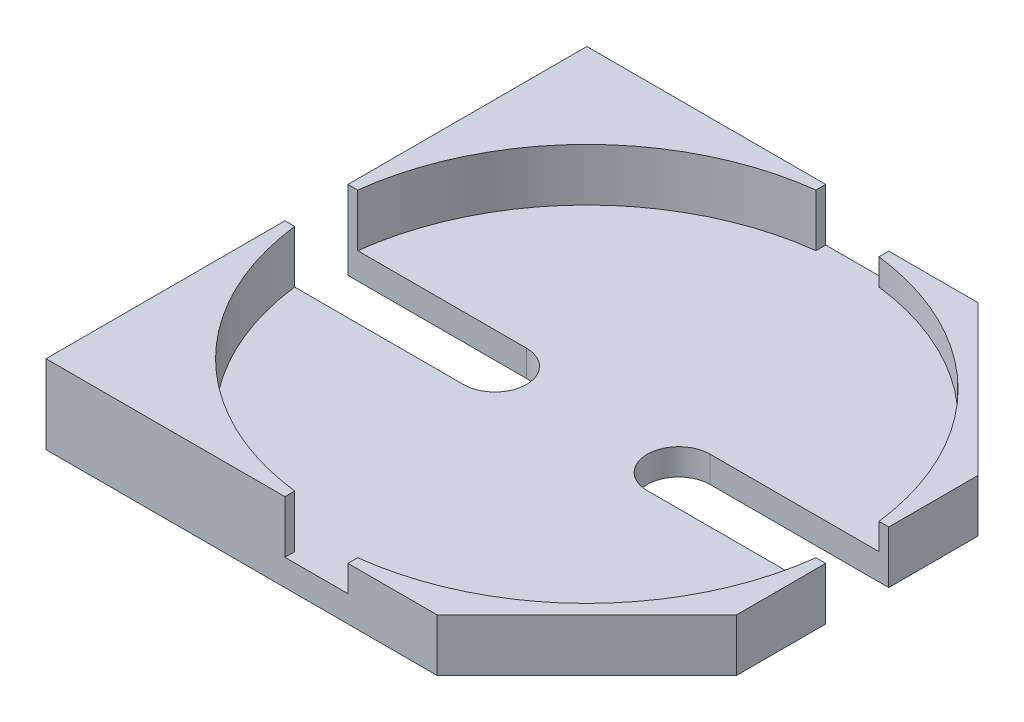
ISO-10303-21;
HEADER;
FILE_DESCRIPTION(('STEP AP214'),'2;1');
FILE_NAME('part.step','',(''),(''),'','','');
FILE_SCHEMA(('AUTOMOTIVE_DESIGN { 1 0 10303 214 1 1 1 1 }'));
ENDSEC;
DATA;
#1=APPLICATION_CONTEXT('core data for automotive mechanical design processes');
#2=APPLICATION_PROTOCOL_DEFINITION('international standard','automotive_design',2000,#1);
#3=PRODUCT_CONTEXT('',#1,'mechanical');
#4=PRODUCT('Part','Part','',(#3));
#5=PRODUCT_RELATED_PRODUCT_CATEGORY('part','',(#4));
#6=PRODUCT_DEFINITION_FORMATION('','',#4);
#7=PRODUCT_DEFINITION_CONTEXT('part definition',#1,'design');
#8=PRODUCT_DEFINITION('design','',#6,#7);
#9=PRODUCT_DEFINITION_SHAPE('','',#8);
#10=(LENGTH_UNIT() NAMED_UNIT(*) SI_UNIT(.MILLI.,.METRE.));
#11=(NAMED_UNIT(*) PLANE_ANGLE_UNIT() SI_UNIT($,.RADIAN.));
#12=(NAMED_UNIT(*) SI_UNIT($,.STERADIAN.) SOLID_ANGLE_UNIT());
#13=UNCERTAINTY_MEASURE_WITH_UNIT(LENGTH_MEASURE(1.E-05),#10,'distance_accuracy_value','');
#14=(GEOMETRIC_REPRESENTATION_CONTEXT(3) GLOBAL_UNCERTAINTY_ASSIGNED_CONTEXT((#13)) GLOBAL_UNIT_ASSIGNED_CONTEXT((#10,
#11,#12)) REPRESENTATION_CONTEXT('',''));
#15=CARTESIAN_POINT('',(0.,0.,0.));
#16=DIRECTION('',(0.,0.,1.));
#17=DIRECTION('',(1.,0.,0.));
#18=AXIS2_PLACEMENT_3D('',#15,#16,#17);
#19=CARTESIAN_POINT('',(1.75,0.5,0.));
#20=DIRECTION('',(0.,1.,0.));
#21=DIRECTION('',(0.,0.,1.));
#22=AXIS2_PLACEMENT_3D('',#19,#20,#21);
#23=PLANE('',#22);
#24=CARTESIAN_POINT('',(0.,0.5,0.));
#25=DIRECTION('',(0.,1.,0.));
#26=DIRECTION('',(0.,0.,1.));
#27=AXIS2_PLACEMENT_3D('',#24,#25,#26);
#28=CIRCLE('',#27,5.);
#29=CARTESIAN_POINT('',(0.600000000000001,0.5,4.96386945839634));
#30=VERTEX_POINT('',#29);
#31=CARTESIAN_POINT('',(4.96386945839634,0.5,0.6));
#32=VERTEX_POINT('',#31);
#33=EDGE_CURVE('E221',#30,#32,#28,.T.);
#34=ORIENTED_EDGE('',*,*,#33,.T.);
#35=DIRECTION('',(-1.,0.,0.));
#36=VECTOR('',#35,1.);
#37=CARTESIAN_POINT('',(1.75,0.5,0.6));
#38=LINE('',#37,#36);
#39=CARTESIAN_POINT('',(1.75,0.5,0.6));
#40=VERTEX_POINT('',#39);
#41=EDGE_CURVE('E340',#32,#40,#38,.T.);
#42=ORIENTED_EDGE('',*,*,#41,.T.);
#43=CARTESIAN_POINT('',(1.75,0.5,0.));
#44=DIRECTION('',(0.,-1.,0.));
#45=DIRECTION('',(0.,0.,1.));
#46=AXIS2_PLACEMENT_3D('',#43,#44,#45);
#47=CIRCLE('',#46,0.6);
#48=CARTESIAN_POINT('',(1.75,0.5,-0.6));
#49=VERTEX_POINT('',#48);
#50=EDGE_CURVE('E343',#40,#49,#47,.T.);
#51=ORIENTED_EDGE('',*,*,#50,.T.);
#52=DIRECTION('',(1.,0.,0.));
#53=VECTOR('',#52,1.);
#54=CARTESIAN_POINT('',(1.75,0.5,-0.6));
#55=LINE('',#54,#53);
#56=CARTESIAN_POINT('',(4.96386945839634,0.5,-0.599999999999999));
#57=VERTEX_POINT('',#56);
#58=EDGE_CURVE('E345',#49,#57,#55,.T.);
#59=ORIENTED_EDGE('',*,*,#58,.T.);
#60=CARTESIAN_POINT('',(0.,0.5,0.));
#61=DIRECTION('',(0.,1.,0.));
#62=DIRECTION('',(0.,0.,1.));
#63=AXIS2_PLACEMENT_3D('',#60,#61,#62);
#64=CIRCLE('',#63,5.);
#65=CARTESIAN_POINT('',(0.6,0.5,-4.96386945839634));
#66=VERTEX_POINT('',#65);
#67=EDGE_CURVE('E224',#57,#66,#64,.T.);
#68=ORIENTED_EDGE('',*,*,#67,.T.);
#69=DIRECTION('',(0.,0.,1.));
#70=VECTOR('',#69,1.);
#71=CARTESIAN_POINT('',(0.6,0.5,0.));
#72=LINE('',#71,#70);
#73=CARTESIAN_POINT('',(0.6,0.5,-5.15));
#74=VERTEX_POINT('',#73);
#75=EDGE_CURVE('E258',#74,#66,#72,.T.);
#76=ORIENTED_EDGE('',*,*,#75,.F.);
#77=DIRECTION('',(-1.,0.,0.));
#78=VECTOR('',#77,1.);
#79=CARTESIAN_POINT('',(2.29999999999999,0.5,-5.15));
#80=LINE('',#79,#78);
#81=CARTESIAN_POINT('',(-0.600000000000016,0.5,-5.15));
#82=VERTEX_POINT('',#81);
#83=EDGE_CURVE('E347',#74,#82,#80,.T.);
#84=ORIENTED_EDGE('',*,*,#83,.T.);
#85=DIRECTION('',(0.,0.,1.));
#86=VECTOR('',#85,1.);
#87=CARTESIAN_POINT('',(-0.600000000000016,0.5,0.));
#88=LINE('',#87,#86);
#89=CARTESIAN_POINT('',(-0.600000000000016,0.5,-4.96386945839634));
#90=VERTEX_POINT('',#89);
#91=EDGE_CURVE('E315',#82,#90,#88,.T.);
#92=ORIENTED_EDGE('',*,*,#91,.T.);
#93=CARTESIAN_POINT('',(0.,0.5,0.));
#94=DIRECTION('',(0.,1.,0.));
#95=DIRECTION('',(0.,0.,1.));
#96=AXIS2_PLACEMENT_3D('',#93,#94,#95);
#97=CIRCLE('',#96,5.);
#98=CARTESIAN_POINT('',(-4.96386945839634,0.5,-0.6));
#99=VERTEX_POINT('',#98);
#100=EDGE_CURVE('E310',#90,#99,#97,.T.);
#101=ORIENTED_EDGE('',*,*,#100,.T.);
#102=DIRECTION('',(1.,0.,0.));
#103=VECTOR('',#102,1.);
#104=CARTESIAN_POINT('',(-1.75,0.5,-0.6));
#105=LINE('',#104,#103);
#106=CARTESIAN_POINT('',(-1.75,0.5,-0.6));
#107=VERTEX_POINT('',#106);
#108=EDGE_CURVE('E349',#99,#107,#105,.T.);
#109=ORIENTED_EDGE('',*,*,#108,.T.);
#110=CARTESIAN_POINT('',(-1.75,0.5,0.));
#111=DIRECTION('',(0.,-1.,0.));
#112=DIRECTION('',(0.,0.,1.));
#113=AXIS2_PLACEMENT_3D('',#110,#111,#112);
#114=CIRCLE('',#113,0.6);
#115=CARTESIAN_POINT('',(-1.75,0.5,0.6));
#116=VERTEX_POINT('',#115);
#117=EDGE_CURVE('E351',#107,#116,#114,.T.);
#118=ORIENTED_EDGE('',*,*,#117,.T.);
#119=DIRECTION('',(-1.,0.,0.));
#120=VECTOR('',#119,1.);
#121=CARTESIAN_POINT('',(-1.75,0.5,0.6));
#122=LINE('',#121,#120);
#123=CARTESIAN_POINT('',(-4.96386945839634,0.5,0.599999999999999));
#124=VERTEX_POINT('',#123);
#125=EDGE_CURVE('E353',#116,#124,#122,.T.);
#126=ORIENTED_EDGE('',*,*,#125,.T.);
#127=CARTESIAN_POINT('',(0.,0.5,0.));
#128=DIRECTION('',(0.,1.,0.));
#129=DIRECTION('',(0.,0.,1.));
#130=AXIS2_PLACEMENT_3D('',#127,#128,#129);
#131=CIRCLE('',#130,5.);
#132=CARTESIAN_POINT('',(-0.600000000000008,0.5,4.96386945839634));
#133=VERTEX_POINT('',#132);
#134=EDGE_CURVE('E283',#124,#133,#131,.T.);
#135=ORIENTED_EDGE('',*,*,#134,.T.);
#136=DIRECTION('',(0.,0.,-1.));
#137=VECTOR('',#136,1.);
#138=CARTESIAN_POINT('',(-0.600000000000008,0.5,0.));
#139=LINE('',#138,#137);
#140=CARTESIAN_POINT('',(-0.600000000000008,0.5,5.15));
#141=VERTEX_POINT('',#140);
#142=EDGE_CURVE('E288',#141,#133,#139,.T.);
#143=ORIENTED_EDGE('',*,*,#142,.F.);
#144=DIRECTION('',(1.,0.,0.));
#145=VECTOR('',#144,1.);
#146=CARTESIAN_POINT('',(2.30000000000003,0.5,5.15));
#147=LINE('',#146,#145);
#148=CARTESIAN_POINT('',(0.600000000000001,0.5,5.15));
#149=VERTEX_POINT('',#148);
#150=EDGE_CURVE('E63',#141,#149,#147,.T.);
#151=ORIENTED_EDGE('',*,*,#150,.T.);
#152=DIRECTION('',(0.,0.,-1.));
#153=VECTOR('',#152,1.);
#154=CARTESIAN_POINT('',(0.600000000000001,0.5,0.));
#155=LINE('',#154,#153);
#156=EDGE_CURVE('E58',#149,#30,#155,.T.);
#157=ORIENTED_EDGE('',*,*,#156,.T.);
#158=EDGE_LOOP('',(#34,#42,#51,#59,#68,#76,#84,#92,#101,#109,#118,#126,#135,#143,#151,#157));
#159=FACE_BOUND('',#158,.T.);
#160=ADVANCED_FACE('F43',(#159),#23,.T.);
#161=CARTESIAN_POINT('',(-5.15,0.5,0.599999999999999));
#162=DIRECTION('',(1.,0.,0.));
#163=DIRECTION('',(0.,0.,-1.));
#164=AXIS2_PLACEMENT_3D('',#161,#162,#163);
#165=PLANE('',#164);
#166=DIRECTION('',(0.,0.,1.));
#167=VECTOR('',#166,1.);
#168=CARTESIAN_POINT('',(-5.15,0.,0.599999999999999));
#169=LINE('',#168,#167);
#170=CARTESIAN_POINT('',(-5.15,0.,0.599999999999999));
#171=VERTEX_POINT('',#170);
#172=CARTESIAN_POINT('',(-5.15,0.,5.15));
#173=VERTEX_POINT('',#172);
#174=EDGE_CURVE('E338',#171,#173,#169,.T.);
#175=ORIENTED_EDGE('',*,*,#174,.T.);
#176=DIRECTION('',(0.,-1.,0.));
#177=VECTOR('',#176,1.);
#178=CARTESIAN_POINT('',(-5.15,0.5,5.15));
#179=LINE('',#178,#177);
#180=CARTESIAN_POINT('',(-5.15,1.5,5.15));
#181=VERTEX_POINT('',#180);
#182=EDGE_CURVE('E11',#181,#173,#179,.T.);
#183=ORIENTED_EDGE('',*,*,#182,.F.);
#184=DIRECTION('',(0.,0.,1.));
#185=VECTOR('',#184,1.);
#186=CARTESIAN_POINT('',(-5.15,1.5,0.));
#187=LINE('',#186,#185);
#188=CARTESIAN_POINT('',(-5.15,1.5,0.599999999999999));
#189=VERTEX_POINT('',#188);
#190=EDGE_CURVE('E291',#189,#181,#187,.T.);
#191=ORIENTED_EDGE('',*,*,#190,.F.);
#192=DIRECTION('',(0.,-1.,0.));
#193=VECTOR('',#192,1.);
#194=CARTESIAN_POINT('',(-5.15,0.5,0.599999999999999));
#195=LINE('',#194,#193);
#196=EDGE_CURVE('E355',#189,#171,#195,.T.);
#197=ORIENTED_EDGE('',*,*,#196,.T.);
#198=EDGE_LOOP('',(#175,#183,#191,#197));
#199=FACE_BOUND('',#198,.T.);
#200=ADVANCED_FACE('F45',(#199),#165,.F.);
#201=CARTESIAN_POINT('',(2.30000000000003,0.5,5.15));
#202=DIRECTION('',(0.,0.,-1.));
#203=DIRECTION('',(-1.,0.,0.));
#204=AXIS2_PLACEMENT_3D('',#201,#202,#203);
#205=PLANE('',#204);
#206=DIRECTION('',(1.,0.,0.));
#207=VECTOR('',#206,1.);
#208=CARTESIAN_POINT('',(2.30000000000003,0.,5.15));
#209=LINE('',#208,#207);
#210=CARTESIAN_POINT('',(2.30000000000003,0.,5.15));
#211=VERTEX_POINT('',#210);
#212=EDGE_CURVE('E358',#173,#211,#209,.T.);
#213=ORIENTED_EDGE('',*,*,#212,.T.);
#214=DIRECTION('',(0.,-1.,0.));
#215=VECTOR('',#214,1.);
#216=CARTESIAN_POINT('',(2.30000000000003,0.5,5.15));
#217=LINE('',#216,#215);
#218=CARTESIAN_POINT('',(2.30000000000003,1.,5.15));
#219=VERTEX_POINT('',#218);
#220=EDGE_CURVE('E51',#219,#211,#217,.T.);
#221=ORIENTED_EDGE('',*,*,#220,.F.);
#222=DIRECTION('',(1.,0.,0.));
#223=VECTOR('',#222,1.);
#224=CARTESIAN_POINT('',(0.,1.,5.15));
#225=LINE('',#224,#223);
#226=CARTESIAN_POINT('',(0.600000000000001,1.,5.15));
#227=VERTEX_POINT('',#226);
#228=EDGE_CURVE('E239',#227,#219,#225,.T.);
#229=ORIENTED_EDGE('',*,*,#228,.F.);
#230=DIRECTION('',(0.,-1.,0.));
#231=VECTOR('',#230,1.);
#232=CARTESIAN_POINT('',(0.600000000000001,1.,5.15));
#233=LINE('',#232,#231);
#234=EDGE_CURVE('E225',#227,#149,#233,.T.);
#235=ORIENTED_EDGE('',*,*,#234,.T.);
#236=ORIENTED_EDGE('',*,*,#150,.F.);
#237=DIRECTION('',(0.,-1.,0.));
#238=VECTOR('',#237,1.);
#239=CARTESIAN_POINT('',(-0.600000000000008,1.5,5.15));
#240=LINE('',#239,#238);
#241=CARTESIAN_POINT('',(-0.600000000000008,1.5,5.15));
#242=VERTEX_POINT('',#241);
#243=EDGE_CURVE('E304',#242,#141,#240,.T.);
#244=ORIENTED_EDGE('',*,*,#243,.F.);
#245=DIRECTION('',(1.,0.,0.));
#246=VECTOR('',#245,1.);
#247=CARTESIAN_POINT('',(0.,1.5,5.15));
#248=LINE('',#247,#246);
#249=EDGE_CURVE('E294',#181,#242,#248,.T.);
#250=ORIENTED_EDGE('',*,*,#249,.F.);
#251=ORIENTED_EDGE('',*,*,#182,.T.);
#252=EDGE_LOOP('',(#213,#221,#229,#235,#236,#244,#250,#251));
#253=FACE_BOUND('',#252,.T.);
#254=ADVANCED_FACE('F441',(#253),#205,.F.);
#255=CARTESIAN_POINT('',(2.30000000000003,0.5,5.15));
#256=DIRECTION('',(-0.707106781186552,0.,-0.707106781186544));
#257=DIRECTION('',(-0.707106781186544,0.,0.707106781186552));
#258=AXIS2_PLACEMENT_3D('',#255,#256,#257);
#259=PLANE('',#258);
#260=DIRECTION('',(0.707106781186544,0.,-0.707106781186552));
#261=VECTOR('',#260,1.);
#262=CARTESIAN_POINT('',(2.30000000000003,0.,5.15));
#263=LINE('',#262,#261);
#264=CARTESIAN_POINT('',(5.15,0.,2.3));
#265=VERTEX_POINT('',#264);
#266=EDGE_CURVE('E360',#211,#265,#263,.T.);
#267=ORIENTED_EDGE('',*,*,#266,.T.);
#268=DIRECTION('',(0.,-1.,0.));
#269=VECTOR('',#268,1.);
#270=CARTESIAN_POINT('',(5.15,0.5,2.3));
#271=LINE('',#270,#269);
#272=CARTESIAN_POINT('',(5.15,1.,2.3));
#273=VERTEX_POINT('',#272);
#274=EDGE_CURVE('E415',#273,#265,#271,.T.);
#275=ORIENTED_EDGE('',*,*,#274,.F.);
#276=DIRECTION('',(0.707106781186544,0.,-0.707106781186552));
#277=VECTOR('',#276,1.);
#278=CARTESIAN_POINT('',(3.72500000000003,1.,3.72499999999999));
#279=LINE('',#278,#277);
#280=EDGE_CURVE('E241',#219,#273,#279,.T.);
#281=ORIENTED_EDGE('',*,*,#280,.F.);
#282=ORIENTED_EDGE('',*,*,#220,.T.);
#283=EDGE_LOOP('',(#267,#275,#281,#282));
#284=FACE_BOUND('',#283,.T.);
#285=ADVANCED_FACE('F421',(#284),#259,.F.);
#286=CARTESIAN_POINT('',(5.15,0.5,0.599999999999999));
#287=DIRECTION('',(-1.,0.,0.));
#288=DIRECTION('',(0.,0.,1.));
#289=AXIS2_PLACEMENT_3D('',#286,#287,#288);
#290=PLANE('',#289);
#291=DIRECTION('',(0.,0.,-1.));
#292=VECTOR('',#291,1.);
#293=CARTESIAN_POINT('',(5.15,0.,0.599999999999999));
#294=LINE('',#293,#292);
#295=CARTESIAN_POINT('',(5.15,0.,0.599999999999999));
#296=VERTEX_POINT('',#295);
#297=EDGE_CURVE('E362',#265,#296,#294,.T.);
#298=ORIENTED_EDGE('',*,*,#297,.T.);
#299=DIRECTION('',(0.,-1.,0.));
#300=VECTOR('',#299,1.);
#301=CARTESIAN_POINT('',(5.15,0.5,0.599999999999999));
#302=LINE('',#301,#300);
#303=CARTESIAN_POINT('',(5.15,1.,0.599999999999999));
#304=VERTEX_POINT('',#303);
#305=EDGE_CURVE('E412',#304,#296,#302,.T.);
#306=ORIENTED_EDGE('',*,*,#305,.F.);
#307=DIRECTION('',(0.,0.,-1.));
#308=VECTOR('',#307,1.);
#309=CARTESIAN_POINT('',(5.15,1.,0.));
#310=LINE('',#309,#308);
#311=EDGE_CURVE('E246',#273,#304,#310,.T.);
#312=ORIENTED_EDGE('',*,*,#311,.F.);
#313=ORIENTED_EDGE('',*,*,#274,.T.);
#314=EDGE_LOOP('',(#298,#306,#312,#313));
#315=FACE_BOUND('',#314,.T.);
#316=ADVANCED_FACE('F430',(#315),#290,.F.);
#317=CARTESIAN_POINT('',(1.75,0.5,0.6));
#318=DIRECTION('',(0.,0.,1.));
#319=DIRECTION('',(1.,0.,0.));
#320=AXIS2_PLACEMENT_3D('',#317,#318,#319);
#321=PLANE('',#320);
#322=DIRECTION('',(-1.,0.,0.));
#323=VECTOR('',#322,1.);
#324=CARTESIAN_POINT('',(1.75,0.,0.6));
#325=LINE('',#324,#323);
#326=CARTESIAN_POINT('',(1.75,0.,0.6));
#327=VERTEX_POINT('',#326);
#328=EDGE_CURVE('E364',#296,#327,#325,.T.);
#329=ORIENTED_EDGE('',*,*,#328,.T.);
#330=DIRECTION('',(0.,-1.,0.));
#331=VECTOR('',#330,1.);
#332=CARTESIAN_POINT('',(1.75,0.5,0.6));
#333=LINE('',#332,#331);
#334=EDGE_CURVE('E409',#40,#327,#333,.T.);
#335=ORIENTED_EDGE('',*,*,#334,.F.);
#336=ORIENTED_EDGE('',*,*,#41,.F.);
#337=DIRECTION('',(0.,-1.,0.));
#338=VECTOR('',#337,1.);
#339=CARTESIAN_POINT('',(4.96386945839634,1.,0.6));
#340=LINE('',#339,#338);
#341=CARTESIAN_POINT('',(4.96386945839634,1.,0.6));
#342=VERTEX_POINT('',#341);
#343=EDGE_CURVE('E249',#342,#32,#340,.T.);
#344=ORIENTED_EDGE('',*,*,#343,.F.);
#345=DIRECTION('',(-1.,0.,0.));
#346=VECTOR('',#345,1.);
#347=CARTESIAN_POINT('',(0.,1.,0.6));
#348=LINE('',#347,#346);
#349=EDGE_CURVE('E234',#304,#342,#348,.T.);
#350=ORIENTED_EDGE('',*,*,#349,.F.);
#351=ORIENTED_EDGE('',*,*,#305,.T.);
#352=EDGE_LOOP('',(#329,#335,#336,#344,#350,#351));
#353=FACE_BOUND('',#352,.T.);
#354=ADVANCED_FACE('F433',(#353),#321,.F.);
#355=CARTESIAN_POINT('',(1.75,0.5,0.));
#356=DIRECTION('',(0.,-1.,0.));
#357=DIRECTION('',(0.,0.,-1.));
#358=AXIS2_PLACEMENT_3D('',#355,#356,#357);
#359=CYLINDRICAL_SURFACE('',#358,0.6);
#360=CARTESIAN_POINT('',(1.75,0.,0.));
#361=DIRECTION('',(0.,-1.,0.));
#362=DIRECTION('',(0.,0.,1.));
#363=AXIS2_PLACEMENT_3D('',#360,#361,#362);
#364=CIRCLE('',#363,0.6);
#365=CARTESIAN_POINT('',(1.75,0.,-0.6));
#366=VERTEX_POINT('',#365);
#367=EDGE_CURVE('E366',#327,#366,#364,.T.);
#368=ORIENTED_EDGE('',*,*,#367,.T.);
#369=DIRECTION('',(0.,-1.,0.));
#370=VECTOR('',#369,1.);
#371=CARTESIAN_POINT('',(1.75,0.5,-0.6));
#372=LINE('',#371,#370);
#373=EDGE_CURVE('E406',#49,#366,#372,.T.);
#374=ORIENTED_EDGE('',*,*,#373,.F.);
#375=ORIENTED_EDGE('',*,*,#50,.F.);
#376=ORIENTED_EDGE('',*,*,#334,.T.);
#377=EDGE_LOOP('',(#368,#374,#375,#376));
#378=FACE_BOUND('',#377,.T.);
#379=ADVANCED_FACE('F480',(#378),#359,.F.);
#380=CARTESIAN_POINT('',(1.75,0.5,-0.6));
#381=DIRECTION('',(0.,0.,-1.));
#382=DIRECTION('',(-1.,0.,0.));
#383=AXIS2_PLACEMENT_3D('',#380,#381,#382);
#384=PLANE('',#383);
#385=DIRECTION('',(1.,0.,0.));
#386=VECTOR('',#385,1.);
#387=CARTESIAN_POINT('',(1.75,0.,-0.6));
#388=LINE('',#387,#386);
#389=CARTESIAN_POINT('',(5.15,0.,-0.599999999999999));
#390=VERTEX_POINT('',#389);
#391=EDGE_CURVE('E368',#366,#390,#388,.T.);
#392=ORIENTED_EDGE('',*,*,#391,.T.);
#393=DIRECTION('',(0.,-1.,0.));
#394=VECTOR('',#393,1.);
#395=CARTESIAN_POINT('',(5.15,0.5,-0.599999999999999));
#396=LINE('',#395,#394);
#397=CARTESIAN_POINT('',(5.15,1.,-0.599999999999999));
#398=VERTEX_POINT('',#397);
#399=EDGE_CURVE('E403',#398,#390,#396,.T.);
#400=ORIENTED_EDGE('',*,*,#399,.F.);
#401=DIRECTION('',(1.,0.,0.));
#402=VECTOR('',#401,1.);
#403=CARTESIAN_POINT('',(0.,1.,-0.6));
#404=LINE('',#403,#402);
#405=CARTESIAN_POINT('',(4.96386945839634,1.,-0.6));
#406=VERTEX_POINT('',#405);
#407=EDGE_CURVE('E257',#406,#398,#404,.T.);
#408=ORIENTED_EDGE('',*,*,#407,.F.);
#409=DIRECTION('',(0.,-1.,0.));
#410=VECTOR('',#409,1.);
#411=CARTESIAN_POINT('',(4.96386945839634,1.,-0.6));
#412=LINE('',#411,#410);
#413=EDGE_CURVE('E280',#406,#57,#412,.T.);
#414=ORIENTED_EDGE('',*,*,#413,.T.);
#415=ORIENTED_EDGE('',*,*,#58,.F.);
#416=ORIENTED_EDGE('',*,*,#373,.T.);
#417=EDGE_LOOP('',(#392,#400,#408,#414,#415,#416));
#418=FACE_BOUND('',#417,.T.);
#419=ADVANCED_FACE('F476',(#418),#384,.F.);
#420=CARTESIAN_POINT('',(5.15,0.5,-2.3));
#421=DIRECTION('',(-1.,0.,0.));
#422=DIRECTION('',(0.,0.,1.));
#423=AXIS2_PLACEMENT_3D('',#420,#421,#422);
#424=PLANE('',#423);
#425=DIRECTION('',(0.,0.,-1.));
#426=VECTOR('',#425,1.);
#427=CARTESIAN_POINT('',(5.15,0.,-2.3));
#428=LINE('',#427,#426);
#429=CARTESIAN_POINT('',(5.15,0.,-2.3));
#430=VERTEX_POINT('',#429);
#431=EDGE_CURVE('E370',#390,#430,#428,.T.);
#432=ORIENTED_EDGE('',*,*,#431,.T.);
#433=DIRECTION('',(0.,-1.,0.));
#434=VECTOR('',#433,1.);
#435=CARTESIAN_POINT('',(5.15,0.5,-2.3));
#436=LINE('',#435,#434);
#437=CARTESIAN_POINT('',(5.15,1.,-2.3));
#438=VERTEX_POINT('',#437);
#439=EDGE_CURVE('E400',#438,#430,#436,.T.);
#440=ORIENTED_EDGE('',*,*,#439,.F.);
#441=DIRECTION('',(0.,0.,-1.));
#442=VECTOR('',#441,1.);
#443=CARTESIAN_POINT('',(5.15,1.,0.));
#444=LINE('',#443,#442);
#445=EDGE_CURVE('E261',#398,#438,#444,.T.);
#446=ORIENTED_EDGE('',*,*,#445,.F.);
#447=ORIENTED_EDGE('',*,*,#399,.T.);
#448=EDGE_LOOP('',(#432,#440,#446,#447));
#449=FACE_BOUND('',#448,.T.);
#450=ADVANCED_FACE('F472',(#449),#424,.F.);
#451=CARTESIAN_POINT('',(2.29999999999999,0.5,-5.15));
#452=DIRECTION('',(-0.707106781186546,0.,0.707106781186549));
#453=DIRECTION('',(0.707106781186549,0.,0.707106781186546));
#454=AXIS2_PLACEMENT_3D('',#451,#452,#453);
#455=PLANE('',#454);
#456=DIRECTION('',(-0.707106781186549,0.,-0.707106781186546));
#457=VECTOR('',#456,1.);
#458=CARTESIAN_POINT('',(2.29999999999999,0.,-5.15));
#459=LINE('',#458,#457);
#460=CARTESIAN_POINT('',(2.29999999999999,0.,-5.15));
#461=VERTEX_POINT('',#460);
#462=EDGE_CURVE('E372',#430,#461,#459,.T.);
#463=ORIENTED_EDGE('',*,*,#462,.T.);
#464=DIRECTION('',(0.,-1.,0.));
#465=VECTOR('',#464,1.);
#466=CARTESIAN_POINT('',(2.29999999999999,0.5,-5.15));
#467=LINE('',#466,#465);
#468=CARTESIAN_POINT('',(2.29999999999999,1.,-5.15));
#469=VERTEX_POINT('',#468);
#470=EDGE_CURVE('E397',#469,#461,#467,.T.);
#471=ORIENTED_EDGE('',*,*,#470,.F.);
#472=DIRECTION('',(-0.707106781186549,0.,-0.707106781186546));
#473=VECTOR('',#472,1.);
#474=CARTESIAN_POINT('',(3.72499999999999,1.,-3.72500000000001));
#475=LINE('',#474,#473);
#476=EDGE_CURVE('E264',#438,#469,#475,.T.);
#477=ORIENTED_EDGE('',*,*,#476,.F.);
#478=ORIENTED_EDGE('',*,*,#439,.T.);
#479=EDGE_LOOP('',(#463,#471,#477,#478));
#480=FACE_BOUND('',#479,.T.);
#481=ADVANCED_FACE('F468',(#480),#455,.F.);
#482=CARTESIAN_POINT('',(2.29999999999999,0.5,-5.15));
#483=DIRECTION('',(0.,0.,1.));
#484=DIRECTION('',(1.,0.,0.));
#485=AXIS2_PLACEMENT_3D('',#482,#483,#484);
#486=PLANE('',#485);
#487=DIRECTION('',(-1.,0.,0.));
#488=VECTOR('',#487,1.);
#489=CARTESIAN_POINT('',(2.29999999999999,0.,-5.15));
#490=LINE('',#489,#488);
#491=CARTESIAN_POINT('',(-5.15,0.,-5.15));
#492=VERTEX_POINT('',#491);
#493=EDGE_CURVE('E374',#461,#492,#490,.T.);
#494=ORIENTED_EDGE('',*,*,#493,.T.);
#495=DIRECTION('',(0.,-1.,0.));
#496=VECTOR('',#495,1.);
#497=CARTESIAN_POINT('',(-5.15,0.5,-5.15));
#498=LINE('',#497,#496);
#499=CARTESIAN_POINT('',(-5.15,1.5,-5.15));
#500=VERTEX_POINT('',#499);
#501=EDGE_CURVE('E394',#500,#492,#498,.T.);
#502=ORIENTED_EDGE('',*,*,#501,.F.);
#503=DIRECTION('',(-1.,0.,0.));
#504=VECTOR('',#503,1.);
#505=CARTESIAN_POINT('',(0.,1.5,-5.15));
#506=LINE('',#505,#504);
#507=CARTESIAN_POINT('',(-0.600000000000016,1.5,-5.15));
#508=VERTEX_POINT('',#507);
#509=EDGE_CURVE('E318',#508,#500,#506,.T.);
#510=ORIENTED_EDGE('',*,*,#509,.F.);
#511=DIRECTION('',(0.,-1.,0.));
#512=VECTOR('',#511,1.);
#513=CARTESIAN_POINT('',(-0.600000000000016,1.5,-5.15));
#514=LINE('',#513,#512);
#515=EDGE_CURVE('E332',#508,#82,#514,.T.);
#516=ORIENTED_EDGE('',*,*,#515,.T.);
#517=ORIENTED_EDGE('',*,*,#83,.F.);
#518=DIRECTION('',(0.,-1.,0.));
#519=VECTOR('',#518,1.);
#520=CARTESIAN_POINT('',(0.6,1.,-5.15));
#521=LINE('',#520,#519);
#522=CARTESIAN_POINT('',(0.6,1.,-5.15));
#523=VERTEX_POINT('',#522);
#524=EDGE_CURVE('E277',#523,#74,#521,.T.);
#525=ORIENTED_EDGE('',*,*,#524,.F.);
#526=DIRECTION('',(-1.,0.,0.));
#527=VECTOR('',#526,1.);
#528=CARTESIAN_POINT('',(0.,1.,-5.15));
#529=LINE('',#528,#527);
#530=EDGE_CURVE('E267',#469,#523,#529,.T.);
#531=ORIENTED_EDGE('',*,*,#530,.F.);
#532=ORIENTED_EDGE('',*,*,#470,.T.);
#533=EDGE_LOOP('',(#494,#502,#510,#516,#517,#525,#531,#532));
#534=FACE_BOUND('',#533,.T.);
#535=ADVANCED_FACE('F464',(#534),#486,.F.);
#536=CARTESIAN_POINT('',(-5.15,0.5,-5.15));
#537=DIRECTION('',(1.,0.,0.));
#538=DIRECTION('',(0.,0.,-1.));
#539=AXIS2_PLACEMENT_3D('',#536,#537,#538);
#540=PLANE('',#539);
#541=DIRECTION('',(0.,0.,1.));
#542=VECTOR('',#541,1.);
#543=CARTESIAN_POINT('',(-5.15,0.,-5.15));
#544=LINE('',#543,#542);
#545=CARTESIAN_POINT('',(-5.15,0.,-0.599999999999999));
#546=VERTEX_POINT('',#545);
#547=EDGE_CURVE('E376',#492,#546,#544,.T.);
#548=ORIENTED_EDGE('',*,*,#547,.T.);
#549=DIRECTION('',(0.,-1.,0.));
#550=VECTOR('',#549,1.);
#551=CARTESIAN_POINT('',(-5.15,0.5,-0.599999999999999));
#552=LINE('',#551,#550);
#553=CARTESIAN_POINT('',(-5.15,1.5,-0.599999999999999));
#554=VERTEX_POINT('',#553);
#555=EDGE_CURVE('E391',#554,#546,#552,.T.);
#556=ORIENTED_EDGE('',*,*,#555,.F.);
#557=DIRECTION('',(0.,0.,1.));
#558=VECTOR('',#557,1.);
#559=CARTESIAN_POINT('',(-5.15,1.5,0.));
#560=LINE('',#559,#558);
#561=EDGE_CURVE('E321',#500,#554,#560,.T.);
#562=ORIENTED_EDGE('',*,*,#561,.F.);
#563=ORIENTED_EDGE('',*,*,#501,.T.);
#564=EDGE_LOOP('',(#548,#556,#562,#563));
#565=FACE_BOUND('',#564,.T.);
#566=ADVANCED_FACE('F460',(#565),#540,.F.);
#567=CARTESIAN_POINT('',(-1.75,0.5,-0.6));
#568=DIRECTION('',(0.,0.,-1.));
#569=DIRECTION('',(-1.,0.,0.));
#570=AXIS2_PLACEMENT_3D('',#567,#568,#569);
#571=PLANE('',#570);
#572=DIRECTION('',(1.,0.,0.));
#573=VECTOR('',#572,1.);
#574=CARTESIAN_POINT('',(-1.75,0.,-0.6));
#575=LINE('',#574,#573);
#576=CARTESIAN_POINT('',(-1.75,0.,-0.6));
#577=VERTEX_POINT('',#576);
#578=EDGE_CURVE('E378',#546,#577,#575,.T.);
#579=ORIENTED_EDGE('',*,*,#578,.T.);
#580=DIRECTION('',(0.,-1.,0.));
#581=VECTOR('',#580,1.);
#582=CARTESIAN_POINT('',(-1.75,0.5,-0.6));
#583=LINE('',#582,#581);
#584=EDGE_CURVE('E388',#107,#577,#583,.T.);
#585=ORIENTED_EDGE('',*,*,#584,.F.);
#586=ORIENTED_EDGE('',*,*,#108,.F.);
#587=DIRECTION('',(0.,-1.,0.));
#588=VECTOR('',#587,1.);
#589=CARTESIAN_POINT('',(-4.96386945839634,1.5,-0.6));
#590=LINE('',#589,#588);
#591=CARTESIAN_POINT('',(-4.96386945839634,1.5,-0.6));
#592=VERTEX_POINT('',#591);
#593=EDGE_CURVE('E326',#592,#99,#590,.T.);
#594=ORIENTED_EDGE('',*,*,#593,.F.);
#595=DIRECTION('',(1.,0.,0.));
#596=VECTOR('',#595,1.);
#597=CARTESIAN_POINT('',(0.,1.5,-0.6));
#598=LINE('',#597,#596);
#599=EDGE_CURVE('E324',#554,#592,#598,.T.);
#600=ORIENTED_EDGE('',*,*,#599,.F.);
#601=ORIENTED_EDGE('',*,*,#555,.T.);
#602=EDGE_LOOP('',(#579,#585,#586,#594,#600,#601));
#603=FACE_BOUND('',#602,.T.);
#604=ADVANCED_FACE('F456',(#603),#571,.F.);
#605=CARTESIAN_POINT('',(-1.75,0.5,0.));
#606=DIRECTION('',(0.,-1.,0.));
#607=DIRECTION('',(0.,0.,-1.));
#608=AXIS2_PLACEMENT_3D('',#605,#606,#607);
#609=CYLINDRICAL_SURFACE('',#608,0.6);
#610=CARTESIAN_POINT('',(-1.75,0.,0.));
#611=DIRECTION('',(0.,-1.,0.));
#612=DIRECTION('',(0.,0.,1.));
#613=AXIS2_PLACEMENT_3D('',#610,#611,#612);
#614=CIRCLE('',#613,0.6);
#615=CARTESIAN_POINT('',(-1.75,0.,0.6));
#616=VERTEX_POINT('',#615);
#617=EDGE_CURVE('E380',#577,#616,#614,.T.);
#618=ORIENTED_EDGE('',*,*,#617,.T.);
#619=DIRECTION('',(0.,-1.,0.));
#620=VECTOR('',#619,1.);
#621=CARTESIAN_POINT('',(-1.75,0.5,0.6));
#622=LINE('',#621,#620);
#623=EDGE_CURVE('E385',#116,#616,#622,.T.);
#624=ORIENTED_EDGE('',*,*,#623,.F.);
#625=ORIENTED_EDGE('',*,*,#117,.F.);
#626=ORIENTED_EDGE('',*,*,#584,.T.);
#627=EDGE_LOOP('',(#618,#624,#625,#626));
#628=FACE_BOUND('',#627,.T.);
#629=ADVANCED_FACE('F452',(#628),#609,.F.);
#630=CARTESIAN_POINT('',(-1.75,0.5,0.6));
#631=DIRECTION('',(0.,0.,1.));
#632=DIRECTION('',(1.,0.,0.));
#633=AXIS2_PLACEMENT_3D('',#630,#631,#632);
#634=PLANE('',#633);
#635=DIRECTION('',(-1.,0.,0.));
#636=VECTOR('',#635,1.);
#637=CARTESIAN_POINT('',(-1.75,0.,0.6));
#638=LINE('',#637,#636);
#639=EDGE_CURVE('E341',#616,#171,#638,.T.);
#640=ORIENTED_EDGE('',*,*,#639,.T.);
#641=ORIENTED_EDGE('',*,*,#196,.F.);
#642=DIRECTION('',(-1.,0.,0.));
#643=VECTOR('',#642,1.);
#644=CARTESIAN_POINT('',(0.,1.5,0.6));
#645=LINE('',#644,#643);
#646=CARTESIAN_POINT('',(-4.96386945839634,1.5,0.6));
#647=VERTEX_POINT('',#646);
#648=EDGE_CURVE('E287',#647,#189,#645,.T.);
#649=ORIENTED_EDGE('',*,*,#648,.F.);
#650=DIRECTION('',(0.,-1.,0.));
#651=VECTOR('',#650,1.);
#652=CARTESIAN_POINT('',(-4.96386945839634,1.5,0.6));
#653=LINE('',#652,#651);
#654=EDGE_CURVE('E307',#647,#124,#653,.T.);
#655=ORIENTED_EDGE('',*,*,#654,.T.);
#656=ORIENTED_EDGE('',*,*,#125,.F.);
#657=ORIENTED_EDGE('',*,*,#623,.T.);
#658=EDGE_LOOP('',(#640,#641,#649,#655,#656,#657));
#659=FACE_BOUND('',#658,.T.);
#660=ADVANCED_FACE('F449',(#659),#634,.F.);
#661=CARTESIAN_POINT('',(1.75,0.,0.));
#662=DIRECTION('',(0.,1.,0.));
#663=DIRECTION('',(0.,0.,1.));
#664=AXIS2_PLACEMENT_3D('',#661,#662,#663);
#665=PLANE('',#664);
#666=ORIENTED_EDGE('',*,*,#174,.F.);
#667=ORIENTED_EDGE('',*,*,#639,.F.);
#668=ORIENTED_EDGE('',*,*,#617,.F.);
#669=ORIENTED_EDGE('',*,*,#578,.F.);
#670=ORIENTED_EDGE('',*,*,#547,.F.);
#671=ORIENTED_EDGE('',*,*,#493,.F.);
#672=ORIENTED_EDGE('',*,*,#462,.F.);
#673=ORIENTED_EDGE('',*,*,#431,.F.);
#674=ORIENTED_EDGE('',*,*,#391,.F.);
#675=ORIENTED_EDGE('',*,*,#367,.F.);
#676=ORIENTED_EDGE('',*,*,#328,.F.);
#677=ORIENTED_EDGE('',*,*,#297,.F.);
#678=ORIENTED_EDGE('',*,*,#266,.F.);
#679=ORIENTED_EDGE('',*,*,#212,.F.);
#680=EDGE_LOOP('',(#666,#667,#668,#669,#670,#671,#672,#673,#674,#675,#676,#677,#678,#679));
#681=FACE_BOUND('',#680,.T.);
#682=ADVANCED_FACE('F426',(#681),#665,.F.);
#683=CARTESIAN_POINT('',(0.,1.5,0.));
#684=DIRECTION('',(0.,-1.,0.));
#685=DIRECTION('',(0.,0.,-1.));
#686=AXIS2_PLACEMENT_3D('',#683,#684,#685);
#687=CYLINDRICAL_SURFACE('',#686,5.);
#688=ORIENTED_EDGE('',*,*,#100,.F.);
#689=DIRECTION('',(0.,-1.,0.));
#690=VECTOR('',#689,1.);
#691=CARTESIAN_POINT('',(-0.600000000000016,1.5,-4.96386945839634));
#692=LINE('',#691,#690);
#693=CARTESIAN_POINT('',(-0.600000000000016,1.5,-4.96386945839634));
#694=VERTEX_POINT('',#693);
#695=EDGE_CURVE('E335',#694,#90,#692,.T.);
#696=ORIENTED_EDGE('',*,*,#695,.F.);
#697=CARTESIAN_POINT('',(0.,1.5,0.));
#698=DIRECTION('',(0.,1.,0.));
#699=DIRECTION('',(0.,0.,1.));
#700=AXIS2_PLACEMENT_3D('',#697,#698,#699);
#701=CIRCLE('',#700,5.);
#702=EDGE_CURVE('E311',#694,#592,#701,.T.);
#703=ORIENTED_EDGE('',*,*,#702,.T.);
#704=ORIENTED_EDGE('',*,*,#593,.T.);
#705=EDGE_LOOP('',(#688,#696,#703,#704));
#706=FACE_BOUND('',#705,.T.);
#707=ADVANCED_FACE('F445',(#706),#687,.F.);
#708=CARTESIAN_POINT('',(-0.600000000000016,1.5,0.));
#709=DIRECTION('',(1.,0.,0.));
#710=DIRECTION('',(0.,0.,-1.));
#711=AXIS2_PLACEMENT_3D('',#708,#709,#710);
#712=PLANE('',#711);
#713=ORIENTED_EDGE('',*,*,#91,.F.);
#714=ORIENTED_EDGE('',*,*,#515,.F.);
#715=DIRECTION('',(0.,0.,1.));
#716=VECTOR('',#715,1.);
#717=CARTESIAN_POINT('',(-0.600000000000016,1.5,0.));
#718=LINE('',#717,#716);
#719=EDGE_CURVE('E314',#508,#694,#718,.T.);
#720=ORIENTED_EDGE('',*,*,#719,.T.);
#721=ORIENTED_EDGE('',*,*,#695,.T.);
#722=EDGE_LOOP('',(#713,#714,#720,#721));
#723=FACE_BOUND('',#722,.T.);
#724=ADVANCED_FACE('F518',(#723),#712,.T.);
#725=CARTESIAN_POINT('',(0.,1.5,0.));
#726=DIRECTION('',(0.,1.,0.));
#727=DIRECTION('',(0.,0.,1.));
#728=AXIS2_PLACEMENT_3D('',#725,#726,#727);
#729=PLANE('',#728);
#730=ORIENTED_EDGE('',*,*,#702,.F.);
#731=ORIENTED_EDGE('',*,*,#719,.F.);
#732=ORIENTED_EDGE('',*,*,#509,.T.);
#733=ORIENTED_EDGE('',*,*,#561,.T.);
#734=ORIENTED_EDGE('',*,*,#599,.T.);
#735=EDGE_LOOP('',(#730,#731,#732,#733,#734));
#736=FACE_BOUND('',#735,.T.);
#737=ADVANCED_FACE('F515',(#736),#729,.T.);
#738=CARTESIAN_POINT('',(0.,1.5,0.));
#739=DIRECTION('',(0.,-1.,0.));
#740=DIRECTION('',(0.,0.,-1.));
#741=AXIS2_PLACEMENT_3D('',#738,#739,#740);
#742=CYLINDRICAL_SURFACE('',#741,5.);
#743=ORIENTED_EDGE('',*,*,#134,.F.);
#744=ORIENTED_EDGE('',*,*,#654,.F.);
#745=CARTESIAN_POINT('',(0.,1.5,0.));
#746=DIRECTION('',(0.,1.,0.));
#747=DIRECTION('',(0.,0.,1.));
#748=AXIS2_PLACEMENT_3D('',#745,#746,#747);
#749=CIRCLE('',#748,5.);
#750=CARTESIAN_POINT('',(-0.600000000000008,1.5,4.96386945839634));
#751=VERTEX_POINT('',#750);
#752=EDGE_CURVE('E284',#647,#751,#749,.T.);
#753=ORIENTED_EDGE('',*,*,#752,.T.);
#754=DIRECTION('',(0.,-1.,0.));
#755=VECTOR('',#754,1.);
#756=CARTESIAN_POINT('',(-0.600000000000008,1.5,4.96386945839634));
#757=LINE('',#756,#755);
#758=EDGE_CURVE('E298',#751,#133,#757,.T.);
#759=ORIENTED_EDGE('',*,*,#758,.T.);
#760=EDGE_LOOP('',(#743,#744,#753,#759));
#761=FACE_BOUND('',#760,.T.);
#762=ADVANCED_FACE('F554',(#761),#742,.F.);
#763=CARTESIAN_POINT('',(-0.600000000000008,1.5,0.));
#764=DIRECTION('',(-1.,0.,0.));
#765=DIRECTION('',(0.,0.,1.));
#766=AXIS2_PLACEMENT_3D('',#763,#764,#765);
#767=PLANE('',#766);
#768=ORIENTED_EDGE('',*,*,#142,.T.);
#769=ORIENTED_EDGE('',*,*,#758,.F.);
#770=DIRECTION('',(0.,0.,-1.));
#771=VECTOR('',#770,1.);
#772=CARTESIAN_POINT('',(-0.600000000000008,1.5,0.));
#773=LINE('',#772,#771);
#774=EDGE_CURVE('E296',#242,#751,#773,.T.);
#775=ORIENTED_EDGE('',*,*,#774,.F.);
#776=ORIENTED_EDGE('',*,*,#243,.T.);
#777=EDGE_LOOP('',(#768,#769,#775,#776));
#778=FACE_BOUND('',#777,.T.);
#779=ADVANCED_FACE('F547',(#778),#767,.F.);
#780=CARTESIAN_POINT('',(0.,1.5,0.));
#781=DIRECTION('',(0.,1.,0.));
#782=DIRECTION('',(0.,0.,1.));
#783=AXIS2_PLACEMENT_3D('',#780,#781,#782);
#784=PLANE('',#783);
#785=ORIENTED_EDGE('',*,*,#752,.F.);
#786=ORIENTED_EDGE('',*,*,#648,.T.);
#787=ORIENTED_EDGE('',*,*,#190,.T.);
#788=ORIENTED_EDGE('',*,*,#249,.T.);
#789=ORIENTED_EDGE('',*,*,#774,.T.);
#790=EDGE_LOOP('',(#785,#786,#787,#788,#789));
#791=FACE_BOUND('',#790,.T.);
#792=ADVANCED_FACE('F540',(#791),#784,.T.);
#793=CARTESIAN_POINT('',(0.,1.,0.));
#794=DIRECTION('',(0.,-1.,0.));
#795=DIRECTION('',(0.,0.,-1.));
#796=AXIS2_PLACEMENT_3D('',#793,#794,#795);
#797=CYLINDRICAL_SURFACE('',#796,5.);
#798=ORIENTED_EDGE('',*,*,#67,.F.);
#799=ORIENTED_EDGE('',*,*,#413,.F.);
#800=CARTESIAN_POINT('',(0.,1.,0.));
#801=DIRECTION('',(0.,1.,0.));
#802=DIRECTION('',(0.,0.,1.));
#803=AXIS2_PLACEMENT_3D('',#800,#801,#802);
#804=CIRCLE('',#803,5.);
#805=CARTESIAN_POINT('',(0.6,1.,-4.96386945839634));
#806=VERTEX_POINT('',#805);
#807=EDGE_CURVE('E254',#406,#806,#804,.T.);
#808=ORIENTED_EDGE('',*,*,#807,.T.);
#809=DIRECTION('',(0.,-1.,0.));
#810=VECTOR('',#809,1.);
#811=CARTESIAN_POINT('',(0.6,1.,-4.96386945839634));
#812=LINE('',#811,#810);
#813=EDGE_CURVE('E271',#806,#66,#812,.T.);
#814=ORIENTED_EDGE('',*,*,#813,.T.);
#815=EDGE_LOOP('',(#798,#799,#808,#814));
#816=FACE_BOUND('',#815,.T.);
#817=ADVANCED_FACE('F538',(#816),#797,.F.);
#818=CARTESIAN_POINT('',(0.6,1.,0.));
#819=DIRECTION('',(1.,0.,0.));
#820=DIRECTION('',(0.,0.,-1.));
#821=AXIS2_PLACEMENT_3D('',#818,#819,#820);
#822=PLANE('',#821);
#823=ORIENTED_EDGE('',*,*,#75,.T.);
#824=ORIENTED_EDGE('',*,*,#813,.F.);
#825=DIRECTION('',(0.,0.,1.));
#826=VECTOR('',#825,1.);
#827=CARTESIAN_POINT('',(0.6,1.,0.));
#828=LINE('',#827,#826);
#829=EDGE_CURVE('E269',#523,#806,#828,.T.);
#830=ORIENTED_EDGE('',*,*,#829,.F.);
#831=ORIENTED_EDGE('',*,*,#524,.T.);
#832=EDGE_LOOP('',(#823,#824,#830,#831));
#833=FACE_BOUND('',#832,.T.);
#834=ADVANCED_FACE('F526',(#833),#822,.F.);
#835=CARTESIAN_POINT('',(0.,1.,0.));
#836=DIRECTION('',(0.,1.,0.));
#837=DIRECTION('',(0.,0.,1.));
#838=AXIS2_PLACEMENT_3D('',#835,#836,#837);
#839=PLANE('',#838);
#840=ORIENTED_EDGE('',*,*,#807,.F.);
#841=ORIENTED_EDGE('',*,*,#407,.T.);
#842=ORIENTED_EDGE('',*,*,#445,.T.);
#843=ORIENTED_EDGE('',*,*,#476,.T.);
#844=ORIENTED_EDGE('',*,*,#530,.T.);
#845=ORIENTED_EDGE('',*,*,#829,.T.);
#846=EDGE_LOOP('',(#840,#841,#842,#843,#844,#845));
#847=FACE_BOUND('',#846,.T.);
#848=ADVANCED_FACE('F529',(#847),#839,.T.);
#849=CARTESIAN_POINT('',(0.,1.,0.));
#850=DIRECTION('',(0.,-1.,0.));
#851=DIRECTION('',(0.,0.,-1.));
#852=AXIS2_PLACEMENT_3D('',#849,#850,#851);
#853=CYLINDRICAL_SURFACE('',#852,5.);
#854=ORIENTED_EDGE('',*,*,#33,.F.);
#855=DIRECTION('',(0.,-1.,0.));
#856=VECTOR('',#855,1.);
#857=CARTESIAN_POINT('',(0.600000000000001,1.,4.96386945839634));
#858=LINE('',#857,#856);
#859=CARTESIAN_POINT('',(0.600000000000001,1.,4.96386945839634));
#860=VERTEX_POINT('',#859);
#861=EDGE_CURVE('E216',#860,#30,#858,.T.);
#862=ORIENTED_EDGE('',*,*,#861,.F.);
#863=CARTESIAN_POINT('',(0.,1.,0.));
#864=DIRECTION('',(0.,1.,0.));
#865=DIRECTION('',(0.,0.,1.));
#866=AXIS2_PLACEMENT_3D('',#863,#864,#865);
#867=CIRCLE('',#866,5.);
#868=EDGE_CURVE('E220',#860,#342,#867,.T.);
#869=ORIENTED_EDGE('',*,*,#868,.T.);
#870=ORIENTED_EDGE('',*,*,#343,.T.);
#871=EDGE_LOOP('',(#854,#862,#869,#870));
#872=FACE_BOUND('',#871,.T.);
#873=ADVANCED_FACE('F218',(#872),#853,.F.);
#874=CARTESIAN_POINT('',(0.600000000000001,1.,0.));
#875=DIRECTION('',(-1.,0.,0.));
#876=DIRECTION('',(0.,0.,1.));
#877=AXIS2_PLACEMENT_3D('',#874,#875,#876);
#878=PLANE('',#877);
#879=ORIENTED_EDGE('',*,*,#156,.F.);
#880=ORIENTED_EDGE('',*,*,#234,.F.);
#881=DIRECTION('',(0.,0.,-1.));
#882=VECTOR('',#881,1.);
#883=CARTESIAN_POINT('',(0.600000000000001,1.,0.));
#884=LINE('',#883,#882);
#885=EDGE_CURVE('E231',#227,#860,#884,.T.);
#886=ORIENTED_EDGE('',*,*,#885,.T.);
#887=ORIENTED_EDGE('',*,*,#861,.T.);
#888=EDGE_LOOP('',(#879,#880,#886,#887));
#889=FACE_BOUND('',#888,.T.);
#890=ADVANCED_FACE('F237',(#889),#878,.T.);
#891=CARTESIAN_POINT('',(0.,1.,0.));
#892=DIRECTION('',(0.,1.,0.));
#893=DIRECTION('',(0.,0.,1.));
#894=AXIS2_PLACEMENT_3D('',#891,#892,#893);
#895=PLANE('',#894);
#896=ORIENTED_EDGE('',*,*,#868,.F.);
#897=ORIENTED_EDGE('',*,*,#885,.F.);
#898=ORIENTED_EDGE('',*,*,#228,.T.);
#899=ORIENTED_EDGE('',*,*,#280,.T.);
#900=ORIENTED_EDGE('',*,*,#311,.T.);
#901=ORIENTED_EDGE('',*,*,#349,.T.);
#902=EDGE_LOOP('',(#896,#897,#898,#899,#900,#901));
#903=FACE_BOUND('',#902,.T.);
#904=ADVANCED_FACE('F229',(#903),#895,.T.);
#905=CLOSED_SHELL('',(#160,#200,#254,#285,#316,#354,#379,#419,#450,#481,#535,#566,#604,#629,
#660,#682,#707,#724,#737,#762,#779,#792,#817,#834,#848,#873,#890,#904));
#906=MANIFOLD_SOLID_BREP('B2',#905);
#907=ADVANCED_BREP_SHAPE_REPRESENTATION('',(#18,#906),#14);
#908=SHAPE_DEFINITION_REPRESENTATION(#9,#907);
ENDSEC;
END-ISO-10303-21;
